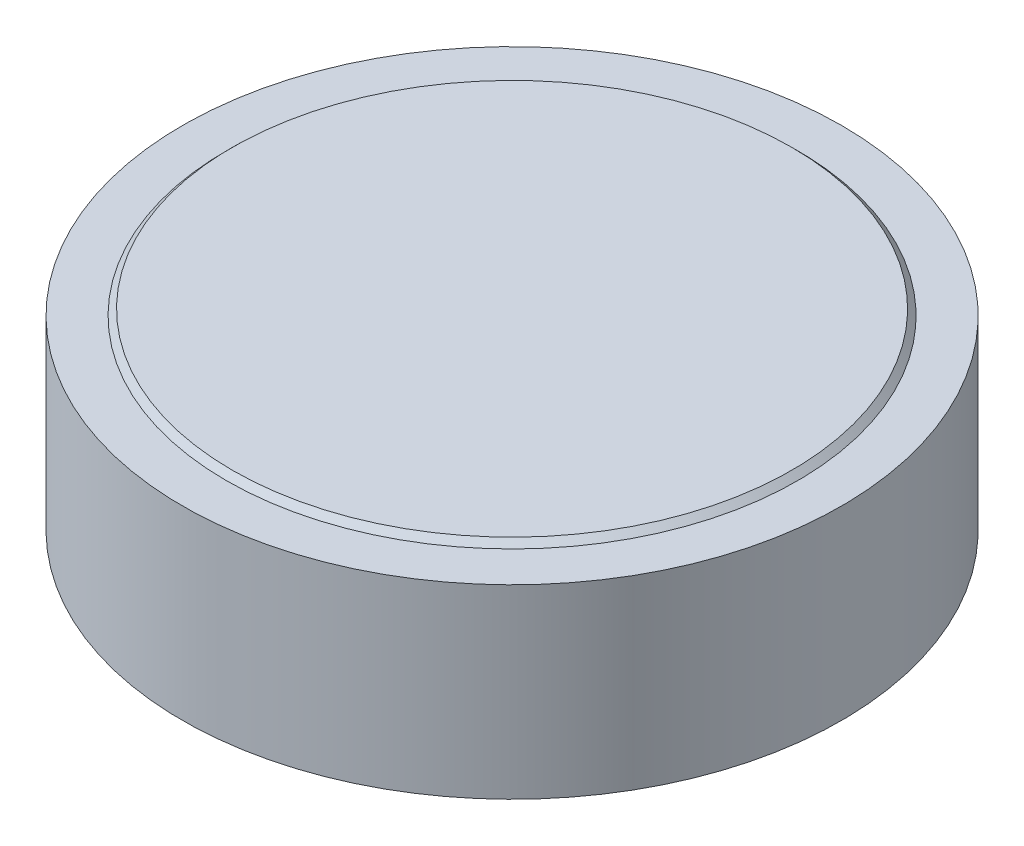
ISO-10303-21;
HEADER;
FILE_DESCRIPTION(('STEP AP214'),'2;1');
FILE_NAME('part.step','',(''),(''),'','','');
FILE_SCHEMA(('AUTOMOTIVE_DESIGN { 1 0 10303 214 1 1 1 1 }'));
ENDSEC;
DATA;
#1=APPLICATION_CONTEXT('core data for automotive mechanical design processes');
#2=APPLICATION_PROTOCOL_DEFINITION('international standard','automotive_design',2000,#1);
#3=PRODUCT_CONTEXT('',#1,'mechanical');
#4=PRODUCT('Part','Part','',(#3));
#5=PRODUCT_RELATED_PRODUCT_CATEGORY('part','',(#4));
#6=PRODUCT_DEFINITION_FORMATION('','',#4);
#7=PRODUCT_DEFINITION_CONTEXT('part definition',#1,'design');
#8=PRODUCT_DEFINITION('design','',#6,#7);
#9=PRODUCT_DEFINITION_SHAPE('','',#8);
#10=(LENGTH_UNIT() NAMED_UNIT(*) SI_UNIT(.MILLI.,.METRE.));
#11=(NAMED_UNIT(*) PLANE_ANGLE_UNIT() SI_UNIT($,.RADIAN.));
#12=(NAMED_UNIT(*) SI_UNIT($,.STERADIAN.) SOLID_ANGLE_UNIT());
#13=UNCERTAINTY_MEASURE_WITH_UNIT(LENGTH_MEASURE(1.E-05),#10,'distance_accuracy_value','');
#14=(GEOMETRIC_REPRESENTATION_CONTEXT(3) GLOBAL_UNCERTAINTY_ASSIGNED_CONTEXT((#13)) GLOBAL_UNIT_ASSIGNED_CONTEXT((#10,
#11,#12)) REPRESENTATION_CONTEXT('',''));
#15=CARTESIAN_POINT('',(0.,0.,0.));
#16=DIRECTION('',(0.,0.,1.));
#17=DIRECTION('',(1.,0.,0.));
#18=AXIS2_PLACEMENT_3D('',#15,#16,#17);
#19=CARTESIAN_POINT('',(0.,3.1,0.));
#20=DIRECTION('',(0.,-1.,0.));
#21=DIRECTION('',(0.,0.,-1.));
#22=AXIS2_PLACEMENT_3D('',#19,#20,#21);
#23=CYLINDRICAL_SURFACE('',#22,5.5);
#24=CARTESIAN_POINT('',(0.,3.1,0.));
#25=DIRECTION('',(0.,1.,0.));
#26=DIRECTION('',(0.,0.,1.));
#27=AXIS2_PLACEMENT_3D('',#24,#25,#26);
#28=CIRCLE('',#27,5.5);
#29=CARTESIAN_POINT('',(0.,3.1,-5.5));
#30=VERTEX_POINT('',#29);
#31=EDGE_CURVE('E42',#30,#30,#28,.T.);
#32=CARTESIAN_POINT('',(0.,0.,0.));
#33=DIRECTION('',(0.,1.,0.));
#34=DIRECTION('',(0.,0.,1.));
#35=AXIS2_PLACEMENT_3D('',#32,#33,#34);
#36=CIRCLE('',#35,5.5);
#37=CARTESIAN_POINT('',(0.,0.,-5.5));
#38=VERTEX_POINT('',#37);
#39=EDGE_CURVE('E46',#38,#38,#36,.T.);
#40=CARTESIAN_POINT('',(0.,3.1,-5.5));
#41=CARTESIAN_POINT('',(0.,3.06770833333333,-5.5));
#42=CARTESIAN_POINT('',(0.,3.03541666666667,-5.5));
#43=CARTESIAN_POINT('',(0.,2.97083333333333,-5.5));
#44=CARTESIAN_POINT('',(0.,2.93854166666667,-5.5));
#45=CARTESIAN_POINT('',(0.,2.87395833333333,-5.5));
#46=CARTESIAN_POINT('',(0.,2.84166666666667,-5.5));
#47=CARTESIAN_POINT('',(0.,2.77708333333333,-5.5));
#48=CARTESIAN_POINT('',(0.,2.74479166666667,-5.5));
#49=CARTESIAN_POINT('',(0.,2.68020833333333,-5.5));
#50=CARTESIAN_POINT('',(0.,2.64791666666667,-5.5));
#51=CARTESIAN_POINT('',(0.,2.58333333333333,-5.5));
#52=CARTESIAN_POINT('',(0.,2.55104166666667,-5.5));
#53=CARTESIAN_POINT('',(0.,2.48645833333333,-5.5));
#54=CARTESIAN_POINT('',(0.,2.45416666666667,-5.5));
#55=CARTESIAN_POINT('',(0.,2.38958333333333,-5.5));
#56=CARTESIAN_POINT('',(0.,2.35729166666667,-5.5));
#57=CARTESIAN_POINT('',(0.,2.29270833333333,-5.5));
#58=CARTESIAN_POINT('',(0.,2.26041666666667,-5.5));
#59=CARTESIAN_POINT('',(0.,2.19583333333333,-5.5));
#60=CARTESIAN_POINT('',(0.,2.16354166666667,-5.5));
#61=CARTESIAN_POINT('',(0.,2.09895833333333,-5.5));
#62=CARTESIAN_POINT('',(0.,2.06666666666667,-5.5));
#63=CARTESIAN_POINT('',(0.,2.00208333333333,-5.5));
#64=CARTESIAN_POINT('',(0.,1.96979166666667,-5.5));
#65=CARTESIAN_POINT('',(0.,1.90520833333333,-5.5));
#66=CARTESIAN_POINT('',(0.,1.87291666666667,-5.5));
#67=CARTESIAN_POINT('',(0.,1.80833333333333,-5.5));
#68=CARTESIAN_POINT('',(0.,1.77604166666667,-5.5));
#69=CARTESIAN_POINT('',(0.,1.71145833333333,-5.5));
#70=CARTESIAN_POINT('',(0.,1.67916666666667,-5.5));
#71=CARTESIAN_POINT('',(0.,1.61458333333333,-5.5));
#72=CARTESIAN_POINT('',(0.,1.58229166666667,-5.5));
#73=CARTESIAN_POINT('',(0.,1.51770833333333,-5.5));
#74=CARTESIAN_POINT('',(0.,1.48541666666667,-5.5));
#75=CARTESIAN_POINT('',(0.,1.42083333333333,-5.5));
#76=CARTESIAN_POINT('',(0.,1.38854166666667,-5.5));
#77=CARTESIAN_POINT('',(0.,1.32395833333333,-5.5));
#78=CARTESIAN_POINT('',(0.,1.29166666666667,-5.5));
#79=CARTESIAN_POINT('',(0.,1.22708333333333,-5.5));
#80=CARTESIAN_POINT('',(0.,1.19479166666667,-5.5));
#81=CARTESIAN_POINT('',(0.,1.13020833333333,-5.5));
#82=CARTESIAN_POINT('',(0.,1.09791666666667,-5.5));
#83=CARTESIAN_POINT('',(0.,1.03333333333333,-5.5));
#84=CARTESIAN_POINT('',(0.,1.00104166666667,-5.5));
#85=CARTESIAN_POINT('',(0.,0.936458333333333,-5.5));
#86=CARTESIAN_POINT('',(0.,0.904166666666667,-5.5));
#87=CARTESIAN_POINT('',(0.,0.839583333333333,-5.5));
#88=CARTESIAN_POINT('',(0.,0.807291666666667,-5.5));
#89=CARTESIAN_POINT('',(0.,0.742708333333333,-5.5));
#90=CARTESIAN_POINT('',(0.,0.710416666666667,-5.5));
#91=CARTESIAN_POINT('',(0.,0.645833333333333,-5.5));
#92=CARTESIAN_POINT('',(0.,0.613541666666667,-5.5));
#93=CARTESIAN_POINT('',(0.,0.548958333333333,-5.5));
#94=CARTESIAN_POINT('',(0.,0.516666666666667,-5.5));
#95=CARTESIAN_POINT('',(0.,0.452083333333333,-5.5));
#96=CARTESIAN_POINT('',(0.,0.419791666666667,-5.5));
#97=CARTESIAN_POINT('',(0.,0.355208333333333,-5.5));
#98=CARTESIAN_POINT('',(0.,0.322916666666667,-5.5));
#99=CARTESIAN_POINT('',(0.,0.258333333333333,-5.5));
#100=CARTESIAN_POINT('',(0.,0.226041666666667,-5.5));
#101=CARTESIAN_POINT('',(0.,0.161458333333333,-5.5));
#102=CARTESIAN_POINT('',(0.,0.129166666666667,-5.5));
#103=CARTESIAN_POINT('',(0.,0.0645833333333335,-5.5));
#104=CARTESIAN_POINT('',(0.,0.0322916666666667,-5.5));
#105=CARTESIAN_POINT('',(0.,0.,-5.5));
#106=B_SPLINE_CURVE_WITH_KNOTS('',3,(#40,#41,#42,#43,#44,#45,#46,#47,#48,#49,#50,#51,#52,#53,
#54,#55,#56,#57,#58,#59,#60,#61,#62,#63,#64,#65,#66,#67,#68,#69,#70,#71,#72,#73,#74,#75,#76,#77,
#78,#79,#80,#81,#82,#83,#84,#85,#86,#87,#88,#89,#90,#91,#92,#93,#94,#95,#96,#97,#98,#99,#100,
#101,#102,#103,#104,#105),.UNSPECIFIED.,.F.,.F.,(4,2,2,2,2,2,2,2,2,2,2,2,2,2,2,2,2,2,2,2,2,2,2,
2,2,2,2,2,2,2,2,2,4),(0.,0.0968749999999997,0.19375,0.290625,0.3875,0.484375,0.58125,0.678125,
0.775,0.871874999999999,0.96875,1.065625,1.1625,1.259375,1.35625,1.453125,1.55,1.646875,1.74375,
1.840625,1.9375,2.034375,2.13125,2.228125,2.325,2.421875,2.51875,2.615625,2.7125,2.809375,
2.90625,3.003125,3.1),.UNSPECIFIED.);
#107=EDGE_CURVE('BSEAM31',#30,#38,#106,.T.);
#108=ORIENTED_EDGE('',*,*,#31,.F.);
#109=ORIENTED_EDGE('',*,*,#39,.T.);
#110=ORIENTED_EDGE('',*,*,#107,.T.);
#111=ORIENTED_EDGE('',*,*,#107,.F.);
#112=EDGE_LOOP('',(#108,#110,#109,#111));
#113=FACE_BOUND('',#112,.T.);
#114=ADVANCED_FACE('F31',(#113),#23,.T.);
#115=CARTESIAN_POINT('',(0.,3.1,0.));
#116=DIRECTION('',(0.,1.,0.));
#117=DIRECTION('',(0.,0.,1.));
#118=AXIS2_PLACEMENT_3D('',#115,#116,#117);
#119=PLANE('',#118);
#120=CARTESIAN_POINT('',(0.,3.1,0.));
#121=DIRECTION('',(0.,1.,0.));
#122=DIRECTION('',(0.,0.,1.));
#123=AXIS2_PLACEMENT_3D('',#120,#121,#122);
#124=CIRCLE('',#123,4.76783525673988);
#125=CARTESIAN_POINT('',(0.,3.1,4.76783525673988));
#126=VERTEX_POINT('',#125);
#127=EDGE_CURVE('E10',#126,#126,#124,.F.);
#128=ORIENTED_EDGE('',*,*,#127,.T.);
#129=EDGE_LOOP('',(#128));
#130=FACE_BOUND('',#129,.T.);
#131=ORIENTED_EDGE('',*,*,#31,.T.);
#132=EDGE_LOOP('',(#131));
#133=FACE_BOUND('',#132,.T.);
#134=ADVANCED_FACE('F56',(#130,#133),#119,.T.);
#135=CARTESIAN_POINT('',(0.,0.,0.));
#136=DIRECTION('',(0.,1.,0.));
#137=DIRECTION('',(0.,0.,1.));
#138=AXIS2_PLACEMENT_3D('',#135,#136,#137);
#139=PLANE('',#138);
#140=ORIENTED_EDGE('',*,*,#39,.F.);
#141=EDGE_LOOP('',(#140));
#142=FACE_BOUND('',#141,.T.);
#143=ADVANCED_FACE('F53',(#142),#139,.F.);
#144=CARTESIAN_POINT('',(0.,3.2,0.));
#145=DIRECTION('',(0.,1.,0.));
#146=DIRECTION('',(0.,0.,1.));
#147=AXIS2_PLACEMENT_3D('',#144,#145,#146);
#148=PLANE('',#147);
#149=CARTESIAN_POINT('',(0.,3.2,0.));
#150=DIRECTION('',(0.,1.,0.));
#151=DIRECTION('',(0.,0.,1.));
#152=AXIS2_PLACEMENT_3D('',#149,#150,#151);
#153=CIRCLE('',#152,4.66783525673988);
#154=CARTESIAN_POINT('',(0.,3.2,4.66783525673988));
#155=VERTEX_POINT('',#154);
#156=EDGE_CURVE('E38',#155,#155,#153,.T.);
#157=ORIENTED_EDGE('',*,*,#156,.T.);
#158=EDGE_LOOP('',(#157));
#159=FACE_BOUND('',#158,.T.);
#160=ADVANCED_FACE('F55',(#159),#148,.T.);
#161=CARTESIAN_POINT('',(0.,3.2,0.));
#162=DIRECTION('',(0.,-1.,0.));
#163=DIRECTION('',(0.,0.,-1.));
#164=AXIS2_PLACEMENT_3D('',#161,#162,#163);
#165=CONICAL_SURFACE('',#164,4.66783525673988,0.785398163397454);
#166=ORIENTED_EDGE('',*,*,#127,.F.);
#167=EDGE_LOOP('',(#166));
#168=FACE_BOUND('',#167,.T.);
#169=ORIENTED_EDGE('',*,*,#156,.F.);
#170=EDGE_LOOP('',(#169));
#171=FACE_BOUND('',#170,.T.);
#172=ADVANCED_FACE('F33',(#168,#171),#165,.T.);
#173=CLOSED_SHELL('',(#114,#134,#143,#160,#172));
#174=MANIFOLD_SOLID_BREP('B2',#173);
#175=ADVANCED_BREP_SHAPE_REPRESENTATION('',(#18,#174),#14);
#176=SHAPE_DEFINITION_REPRESENTATION(#9,#175);
ENDSEC;
END-ISO-10303-21;
